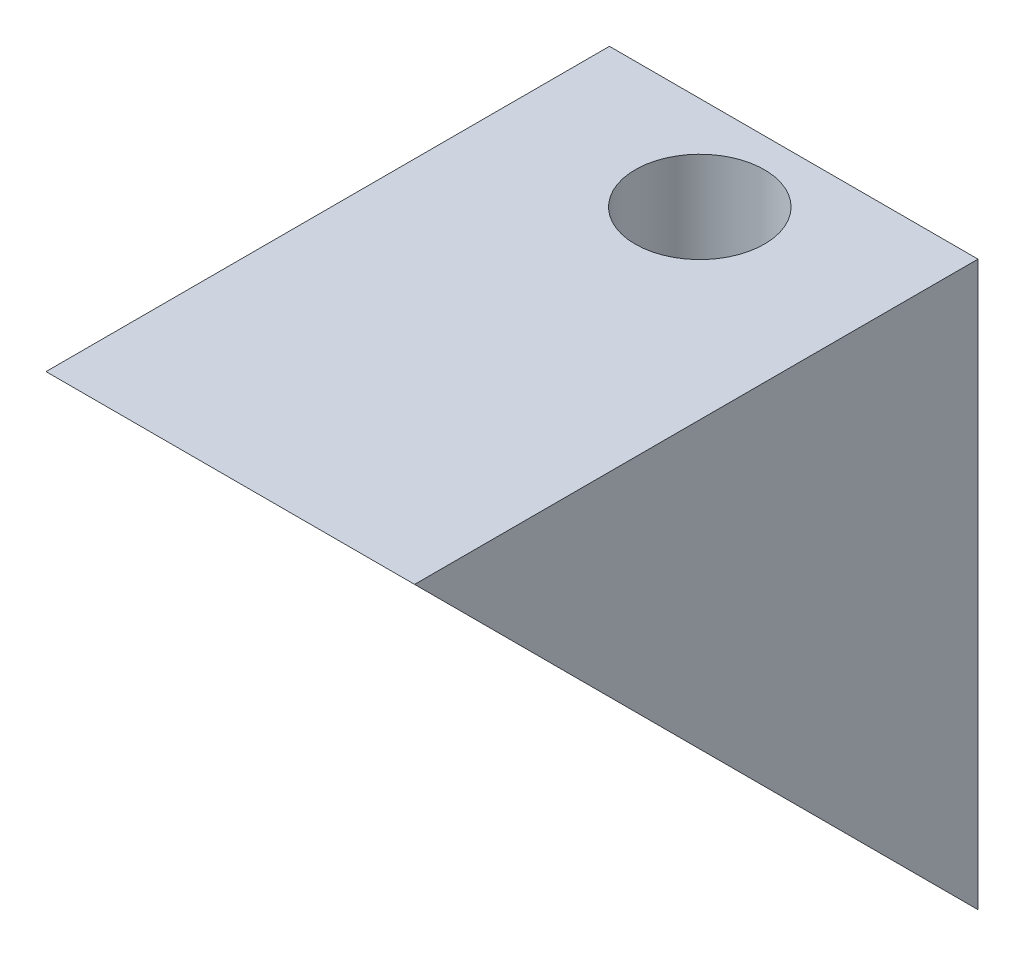
ISO-10303-21;
HEADER;
FILE_DESCRIPTION(('STEP AP214'),'2;1');
FILE_NAME('part.step','',(''),(''),'','','');
FILE_SCHEMA(('AUTOMOTIVE_DESIGN { 1 0 10303 214 1 1 1 1 }'));
ENDSEC;
DATA;
#1=APPLICATION_CONTEXT('core data for automotive mechanical design processes');
#2=APPLICATION_PROTOCOL_DEFINITION('international standard','automotive_design',2000,#1);
#3=PRODUCT_CONTEXT('',#1,'mechanical');
#4=PRODUCT('Part','Part','',(#3));
#5=PRODUCT_RELATED_PRODUCT_CATEGORY('part','',(#4));
#6=PRODUCT_DEFINITION_FORMATION('','',#4);
#7=PRODUCT_DEFINITION_CONTEXT('part definition',#1,'design');
#8=PRODUCT_DEFINITION('design','',#6,#7);
#9=PRODUCT_DEFINITION_SHAPE('','',#8);
#10=(LENGTH_UNIT() NAMED_UNIT(*) SI_UNIT(.MILLI.,.METRE.));
#11=(NAMED_UNIT(*) PLANE_ANGLE_UNIT() SI_UNIT($,.RADIAN.));
#12=(NAMED_UNIT(*) SI_UNIT($,.STERADIAN.) SOLID_ANGLE_UNIT());
#13=UNCERTAINTY_MEASURE_WITH_UNIT(LENGTH_MEASURE(1.E-05),#10,'distance_accuracy_value','');
#14=(GEOMETRIC_REPRESENTATION_CONTEXT(3) GLOBAL_UNCERTAINTY_ASSIGNED_CONTEXT((#13)) GLOBAL_UNIT_ASSIGNED_CONTEXT((#10,
#11,#12)) REPRESENTATION_CONTEXT('',''));
#15=CARTESIAN_POINT('',(0.,0.,0.));
#16=DIRECTION('',(0.,0.,1.));
#17=DIRECTION('',(1.,0.,0.));
#18=AXIS2_PLACEMENT_3D('',#15,#16,#17);
#19=CARTESIAN_POINT('',(39.25,-24.35604681,100.));
#20=DIRECTION('',(0.,-1.,0.));
#21=DIRECTION('',(0.,0.,-1.));
#22=AXIS2_PLACEMENT_3D('',#19,#20,#21);
#23=PLANE('',#22);
#24=CARTESIAN_POINT('',(0.,-24.35604681,0.));
#25=DIRECTION('',(0.,1.,0.));
#26=DIRECTION('',(0.,0.,1.));
#27=AXIS2_PLACEMENT_3D('',#24,#25,#26);
#28=CIRCLE('',#27,13.75);
#29=CARTESIAN_POINT('',(0.,-24.35604681,13.75));
#30=VERTEX_POINT('',#29);
#31=EDGE_CURVE('E97',#30,#30,#28,.T.);
#32=ORIENTED_EDGE('',*,*,#31,.F.);
#33=EDGE_LOOP('',(#32));
#34=FACE_BOUND('',#33,.T.);
#35=DIRECTION('',(0.,0.,1.));
#36=VECTOR('',#35,1.);
#37=CARTESIAN_POINT('',(-39.25,-24.35604681,100.));
#38=LINE('',#37,#36);
#39=CARTESIAN_POINT('',(-39.25,-24.35604681,-20.));
#40=VERTEX_POINT('',#39);
#41=CARTESIAN_POINT('',(-39.25,-24.35604681,100.));
#42=VERTEX_POINT('',#41);
#43=EDGE_CURVE('E90',#40,#42,#38,.T.);
#44=ORIENTED_EDGE('',*,*,#43,.T.);
#45=DIRECTION('',(-1.,0.,0.));
#46=VECTOR('',#45,1.);
#47=CARTESIAN_POINT('',(39.25,-24.35604681,100.));
#48=LINE('',#47,#46);
#49=CARTESIAN_POINT('',(39.25,-24.35604681,100.));
#50=VERTEX_POINT('',#49);
#51=EDGE_CURVE('E12',#50,#42,#48,.T.);
#52=ORIENTED_EDGE('',*,*,#51,.F.);
#53=DIRECTION('',(0.,0.,1.));
#54=VECTOR('',#53,1.);
#55=CARTESIAN_POINT('',(39.25,-24.35604681,100.));
#56=LINE('',#55,#54);
#57=CARTESIAN_POINT('',(39.25,-24.35604681,-20.));
#58=VERTEX_POINT('',#57);
#59=EDGE_CURVE('E83',#58,#50,#56,.T.);
#60=ORIENTED_EDGE('',*,*,#59,.F.);
#61=DIRECTION('',(-1.,0.,0.));
#62=VECTOR('',#61,1.);
#63=CARTESIAN_POINT('',(39.25,-24.35604681,-20.));
#64=LINE('',#63,#62);
#65=EDGE_CURVE('E91',#58,#40,#64,.T.);
#66=ORIENTED_EDGE('',*,*,#65,.T.);
#67=EDGE_LOOP('',(#44,#52,#60,#66));
#68=FACE_BOUND('',#67,.T.);
#69=ADVANCED_FACE('F36',(#34,#68),#23,.F.);
#70=CARTESIAN_POINT('',(39.25,-24.35604681,100.));
#71=DIRECTION('',(0.,0.707106781186549,-0.707106781186546));
#72=DIRECTION('',(0.,0.707106781186546,0.707106781186549));
#73=AXIS2_PLACEMENT_3D('',#70,#71,#72);
#74=PLANE('',#73);
#75=DIRECTION('',(0.,-0.707106781186546,-0.707106781186549));
#76=VECTOR('',#75,1.);
#77=CARTESIAN_POINT('',(-39.25,-24.35604681,100.));
#78=LINE('',#77,#76);
#79=CARTESIAN_POINT('',(-39.25,-144.35604681,-20.));
#80=VERTEX_POINT('',#79);
#81=EDGE_CURVE('E71',#42,#80,#78,.T.);
#82=ORIENTED_EDGE('',*,*,#81,.T.);
#83=DIRECTION('',(-1.,0.,0.));
#84=VECTOR('',#83,1.);
#85=CARTESIAN_POINT('',(39.25,-144.35604681,-20.));
#86=LINE('',#85,#84);
#87=CARTESIAN_POINT('',(39.25,-144.35604681,-20.));
#88=VERTEX_POINT('',#87);
#89=EDGE_CURVE('E50',#88,#80,#86,.T.);
#90=ORIENTED_EDGE('',*,*,#89,.F.);
#91=DIRECTION('',(0.,-0.707106781186546,-0.707106781186549));
#92=VECTOR('',#91,1.);
#93=CARTESIAN_POINT('',(39.25,-24.35604681,100.));
#94=LINE('',#93,#92);
#95=EDGE_CURVE('E79',#50,#88,#94,.T.);
#96=ORIENTED_EDGE('',*,*,#95,.F.);
#97=ORIENTED_EDGE('',*,*,#51,.T.);
#98=EDGE_LOOP('',(#82,#90,#96,#97));
#99=FACE_BOUND('',#98,.T.);
#100=ADVANCED_FACE('F80',(#99),#74,.F.);
#101=CARTESIAN_POINT('',(39.25,-24.35604681,-20.));
#102=DIRECTION('',(0.,0.,1.));
#103=DIRECTION('',(0.,-1.,0.));
#104=AXIS2_PLACEMENT_3D('',#101,#102,#103);
#105=PLANE('',#104);
#106=CARTESIAN_POINT('',(0.,-59.35604681,-20.));
#107=DIRECTION('',(0.,0.,-1.));
#108=DIRECTION('',(0.,1.,0.));
#109=AXIS2_PLACEMENT_3D('',#106,#107,#108);
#110=CIRCLE('',#109,3.5);
#111=CARTESIAN_POINT('',(0.,-55.85604681,-20.));
#112=VERTEX_POINT('',#111);
#113=EDGE_CURVE('E109',#112,#112,#110,.T.);
#114=ORIENTED_EDGE('',*,*,#113,.F.);
#115=EDGE_LOOP('',(#114));
#116=FACE_BOUND('',#115,.T.);
#117=CARTESIAN_POINT('',(0.,-74.35604681,-20.));
#118=DIRECTION('',(0.,0.,-1.));
#119=DIRECTION('',(0.,1.,0.));
#120=AXIS2_PLACEMENT_3D('',#117,#118,#119);
#121=CIRCLE('',#120,3.50000000000001);
#122=CARTESIAN_POINT('',(0.,-70.85604681,-20.));
#123=VERTEX_POINT('',#122);
#124=EDGE_CURVE('E187',#123,#123,#121,.T.);
#125=ORIENTED_EDGE('',*,*,#124,.F.);
#126=EDGE_LOOP('',(#125));
#127=FACE_BOUND('',#126,.T.);
#128=DIRECTION('',(0.,1.,0.));
#129=VECTOR('',#128,1.);
#130=CARTESIAN_POINT('',(-39.25,-24.35604681,-20.));
#131=LINE('',#130,#129);
#132=EDGE_CURVE('E76',#80,#40,#131,.T.);
#133=ORIENTED_EDGE('',*,*,#132,.T.);
#134=ORIENTED_EDGE('',*,*,#65,.F.);
#135=DIRECTION('',(0.,1.,0.));
#136=VECTOR('',#135,1.);
#137=CARTESIAN_POINT('',(39.25,-24.35604681,-20.));
#138=LINE('',#137,#136);
#139=EDGE_CURVE('E59',#88,#58,#138,.T.);
#140=ORIENTED_EDGE('',*,*,#139,.F.);
#141=ORIENTED_EDGE('',*,*,#89,.T.);
#142=EDGE_LOOP('',(#133,#134,#140,#141));
#143=FACE_BOUND('',#142,.T.);
#144=ADVANCED_FACE('F153',(#116,#127,#143),#105,.F.);
#145=CARTESIAN_POINT('',(39.25,0.,0.));
#146=DIRECTION('',(-1.,0.,0.));
#147=DIRECTION('',(0.,0.,1.));
#148=AXIS2_PLACEMENT_3D('',#145,#146,#147);
#149=PLANE('',#148);
#150=ORIENTED_EDGE('',*,*,#59,.T.);
#151=ORIENTED_EDGE('',*,*,#95,.T.);
#152=ORIENTED_EDGE('',*,*,#139,.T.);
#153=EDGE_LOOP('',(#150,#151,#152));
#154=FACE_BOUND('',#153,.T.);
#155=ADVANCED_FACE('F86',(#154),#149,.F.);
#156=CARTESIAN_POINT('',(-39.25,0.,0.));
#157=DIRECTION('',(-1.,0.,0.));
#158=DIRECTION('',(0.,0.,1.));
#159=AXIS2_PLACEMENT_3D('',#156,#157,#158);
#160=PLANE('',#159);
#161=ORIENTED_EDGE('',*,*,#43,.F.);
#162=ORIENTED_EDGE('',*,*,#132,.F.);
#163=ORIENTED_EDGE('',*,*,#81,.F.);
#164=EDGE_LOOP('',(#161,#162,#163));
#165=FACE_BOUND('',#164,.T.);
#166=ADVANCED_FACE('F160',(#165),#160,.T.);
#167=CARTESIAN_POINT('',(0.,-54.35604681,0.));
#168=DIRECTION('',(0.,1.,0.));
#169=DIRECTION('',(0.,0.,1.));
#170=AXIS2_PLACEMENT_3D('',#167,#168,#169);
#171=CYLINDRICAL_SURFACE('',#170,13.75);
#172=CARTESIAN_POINT('',(0.,-54.35604681,0.));
#173=DIRECTION('',(0.,1.,0.));
#174=DIRECTION('',(0.,0.,1.));
#175=AXIS2_PLACEMENT_3D('',#172,#173,#174);
#176=CIRCLE('',#175,13.75);
#177=CARTESIAN_POINT('',(0.,-54.35604681,13.75));
#178=VERTEX_POINT('',#177);
#179=EDGE_CURVE('E93',#178,#178,#176,.T.);
#180=ORIENTED_EDGE('',*,*,#179,.F.);
#181=EDGE_LOOP('',(#180));
#182=FACE_BOUND('',#181,.T.);
#183=ORIENTED_EDGE('',*,*,#31,.T.);
#184=EDGE_LOOP('',(#183));
#185=FACE_BOUND('',#184,.T.);
#186=ADVANCED_FACE('F147',(#182,#185),#171,.F.);
#187=CARTESIAN_POINT('',(0.,-54.35604681,0.));
#188=DIRECTION('',(0.,1.,0.));
#189=DIRECTION('',(0.,0.,1.));
#190=AXIS2_PLACEMENT_3D('',#187,#188,#189);
#191=PLANE('',#190);
#192=CARTESIAN_POINT('',(0.,-54.35604681,0.));
#193=DIRECTION('',(0.,1.,0.));
#194=DIRECTION('',(0.,0.,1.));
#195=AXIS2_PLACEMENT_3D('',#192,#193,#194);
#196=CIRCLE('',#195,10.1);
#197=CARTESIAN_POINT('',(0.,-54.35604681,10.1));
#198=VERTEX_POINT('',#197);
#199=EDGE_CURVE('E139',#198,#198,#196,.T.);
#200=ORIENTED_EDGE('',*,*,#199,.F.);
#201=EDGE_LOOP('',(#200));
#202=FACE_BOUND('',#201,.T.);
#203=ORIENTED_EDGE('',*,*,#179,.T.);
#204=EDGE_LOOP('',(#203));
#205=FACE_BOUND('',#204,.T.);
#206=ADVANCED_FACE('F123',(#202,#205),#191,.T.);
#207=CARTESIAN_POINT('',(0.,-84.35604681,0.));
#208=DIRECTION('',(0.,1.,0.));
#209=DIRECTION('',(0.,0.,1.));
#210=AXIS2_PLACEMENT_3D('',#207,#208,#209);
#211=PLANE('',#210);
#212=CARTESIAN_POINT('',(0.,-84.35604681,0.));
#213=DIRECTION('',(0.,1.,0.));
#214=DIRECTION('',(0.,0.,1.));
#215=AXIS2_PLACEMENT_3D('',#212,#213,#214);
#216=CIRCLE('',#215,9.5);
#217=CARTESIAN_POINT('',(0.,-84.35604681,9.5));
#218=VERTEX_POINT('',#217);
#219=EDGE_CURVE('E132',#218,#218,#216,.T.);
#220=ORIENTED_EDGE('',*,*,#219,.T.);
#221=EDGE_LOOP('',(#220));
#222=FACE_BOUND('',#221,.T.);
#223=ADVANCED_FACE('F120',(#222),#211,.T.);
#224=CARTESIAN_POINT('',(0.,-84.35604681,0.));
#225=DIRECTION('',(0.,1.,0.));
#226=DIRECTION('',(0.,0.,1.));
#227=AXIS2_PLACEMENT_3D('',#224,#225,#226);
#228=CONICAL_SURFACE('',#227,9.5,0.0199973339731505);
#229=CARTESIAN_POINT('',(-2.58201939740681,-61.718921294905,-9.6119851907806));
#230=CARTESIAN_POINT('',(-2.71236973137917,-61.5764828166199,-9.57992152612602));
#231=CARTESIAN_POINT('',(-2.83097248247537,-61.4231876758991,-9.54842095491079));
#232=CARTESIAN_POINT('',(-3.04158905887252,-61.0985018492966,-9.49025414096341));
#233=CARTESIAN_POINT('',(-3.13361241418318,-60.9271176793838,-9.46358616679058));
#234=CARTESIAN_POINT('',(-3.2884809808705,-60.57006419376,-9.41846215352416));
#235=CARTESIAN_POINT('',(-3.35125437185349,-60.3843610073078,-9.4000263322433));
#236=CARTESIAN_POINT('',(-3.4449892283669,-60.0043580770517,-9.3741819587663));
#237=CARTESIAN_POINT('',(-3.47596107110103,-59.8100611590797,-9.36676980906758));
#238=CARTESIAN_POINT('',(-3.50433984978546,-59.4268760744014,-9.36437098442674));
#239=CARTESIAN_POINT('',(-3.50305298462761,-59.2380867589754,-9.36889414106958));
#240=CARTESIAN_POINT('',(-3.47029681052306,-58.8637670438215,-9.38905706488923));
#241=CARTESIAN_POINT('',(-3.43882730737294,-58.6782366650703,-9.40469690359368));
#242=CARTESIAN_POINT('',(-3.34761377520433,-58.3179831694567,-9.44518626886772));
#243=CARTESIAN_POINT('',(-3.28824392047876,-58.1431506484808,-9.46991300091001));
#244=CARTESIAN_POINT('',(-3.14334549924877,-57.8058545640709,-9.5260913716928));
#245=CARTESIAN_POINT('',(-3.05781019908335,-57.6433941980606,-9.55754474090148));
#246=CARTESIAN_POINT('',(-2.85766098333135,-57.326067202852,-9.62596214699992));
#247=CARTESIAN_POINT('',(-2.74173682025032,-57.1720710450562,-9.66313090881959));
#248=CARTESIAN_POINT('',(-2.48628632731484,-56.8851569507851,-9.7379085881953));
#249=CARTESIAN_POINT('',(-2.34675279312978,-56.7522454722969,-9.77551763683312));
#250=CARTESIAN_POINT('',(-2.04098721135056,-56.5056937319486,-9.84903326270974));
#251=CARTESIAN_POINT('',(-1.87388459336361,-56.3930879480704,-9.88480348877476));
#252=CARTESIAN_POINT('',(-1.52174958430814,-56.197758368973,-9.94904773264359));
#253=CARTESIAN_POINT('',(-1.33672128709907,-56.1150277711786,-9.97752341098509));
#254=CARTESIAN_POINT('',(-0.959623803056336,-55.9844388593931,-10.0233372064292));
#255=CARTESIAN_POINT('',(-0.767925463836306,-55.9356202733142,-10.0409802156533));
#256=CARTESIAN_POINT('',(-0.378363483986849,-55.8709667268788,-10.0644792768575));
#257=CARTESIAN_POINT('',(-0.180502302053071,-55.8551187795516,-10.0703399698028));
#258=CARTESIAN_POINT('',(0.204241777691315,-55.8570070473154,-10.069648130062));
#259=CARTESIAN_POINT('',(0.391137347006137,-55.8729661952627,-10.0637524198804));
#260=CARTESIAN_POINT('',(0.759364799929047,-55.9343215034837,-10.0414523810524));
#261=CARTESIAN_POINT('',(0.940696721172309,-55.9797174645869,-10.0250481235074));
#262=CARTESIAN_POINT('',(1.292473514902,-56.0981504418451,-9.98339850426264));
#263=CARTESIAN_POINT('',(1.46294359202036,-56.1711205236371,-9.95817456275357));
#264=CARTESIAN_POINT('',(1.78943463299328,-56.3424219840047,-9.90123745289614));
#265=CARTESIAN_POINT('',(1.94545198501305,-56.4407596790064,-9.86952266876294));
#266=CARTESIAN_POINT('',(2.24725792837589,-56.6658658106568,-9.8007134416711));
#267=CARTESIAN_POINT('',(2.39210421804733,-56.7938388128792,-9.76342592353129));
#268=CARTESIAN_POINT('',(2.65881264956121,-57.0717881757329,-9.68843279031808));
#269=CARTESIAN_POINT('',(2.78066708891278,-57.2217718803517,-9.65072703959597));
#270=CARTESIAN_POINT('',(3.00263922358571,-57.5465388760475,-9.57723796190652));
#271=CARTESIAN_POINT('',(3.10172448712101,-57.7220609565485,-9.5415868600036));
#272=CARTESIAN_POINT('',(3.26868079755507,-58.0886646193109,-9.47793989841857));
#273=CARTESIAN_POINT('',(3.3365611378316,-58.2797415490826,-9.44994176055683));
#274=CARTESIAN_POINT('',(3.43684189571894,-58.6657014763994,-9.40570941708431));
#275=CARTESIAN_POINT('',(3.4703116172217,-58.8602652344402,-9.38912632898276));
#276=CARTESIAN_POINT('',(3.50401638816326,-59.2528718744232,-9.36822043314272));
#277=CARTESIAN_POINT('',(3.50426513095359,-59.4509132892447,-9.3638925746425));
#278=CARTESIAN_POINT('',(3.47235808872159,-59.8328882478777,-9.36761827225549));
#279=CARTESIAN_POINT('',(3.44203700721299,-60.0169854988537,-9.374984389152));
#280=CARTESIAN_POINT('',(3.35280392642501,-60.3774091310191,-9.39961089087964));
#281=CARTESIAN_POINT('',(3.29388918160101,-60.553734764209,-9.41687222587192));
#282=CARTESIAN_POINT('',(3.14880884843814,-60.8954457306937,-9.45916997071793));
#283=CARTESIAN_POINT('',(3.06242691616913,-61.0607311528926,-9.48426807722839));
#284=CARTESIAN_POINT('',(2.86501366309831,-61.3749962020036,-9.53919342061848));
#285=CARTESIAN_POINT('',(2.75397520323971,-61.5239710876689,-9.56902202645165));
#286=CARTESIAN_POINT('',(2.50313176191756,-61.8101276969745,-9.63185848774859));
#287=CARTESIAN_POINT('',(2.36206881036129,-61.9461900530742,-9.66495088296791));
#288=CARTESIAN_POINT('',(2.05892796453689,-62.1931300701925,-9.72898601033028));
#289=CARTESIAN_POINT('',(1.89684707139614,-62.3040041310818,-9.7599284347427));
#290=CARTESIAN_POINT('',(1.55268663000347,-62.4991261882879,-9.81665797715129));
#291=CARTESIAN_POINT('',(1.37030964790856,-62.582880441524,-9.8423466621675));
#292=CARTESIAN_POINT('',(0.993009668541796,-62.7181980646067,-9.88481481228722));
#293=CARTESIAN_POINT('',(0.798090816791161,-62.7697720114732,-9.90159720443877));
#294=CARTESIAN_POINT('',(0.409843238759442,-62.8373171488154,-9.92373965215336));
#295=CARTESIAN_POINT('',(0.216779454927066,-62.8546667460497,-9.92954153809739));
#296=CARTESIAN_POINT('',(-0.169558021453091,-62.85726759664,-9.93040550806121));
#297=CARTESIAN_POINT('',(-0.362831654543645,-62.8425263351644,-9.92547009654766));
#298=CARTESIAN_POINT('',(-0.737789219785745,-62.7825021902172,-9.90575362415688));
#299=CARTESIAN_POINT('',(-0.919646565264239,-62.7381894576409,-9.89128548861528));
#300=CARTESIAN_POINT('',(-1.27330030767453,-62.6215341183204,-9.85436103090737));
#301=CARTESIAN_POINT('',(-1.4450928691076,-62.5491809048387,-9.83190168620856));
#302=CARTESIAN_POINT('',(-1.79249884021066,-62.369233063775,-9.77852114896076));
#303=CARTESIAN_POINT('',(-1.96646276159579,-62.2586424332364,-9.74694183720316));
#304=CARTESIAN_POINT('',(-2.2920412756116,-62.0090918681913,-9.68069252566385));
#305=CARTESIAN_POINT('',(-2.4436491432807,-61.8701234271667,-9.64602160090141));
#306=CARTESIAN_POINT('',(-2.58201939740681,-61.718921294905,-9.6119851907806));
#307=B_SPLINE_CURVE_WITH_KNOTS('',3,(#229,#230,#231,#232,#233,#234,#235,#236,#237,#238,#239,
#240,#241,#242,#243,#244,#245,#246,#247,#248,#249,#250,#251,#252,#253,#254,#255,#256,#257,#258,
#259,#260,#261,#262,#263,#264,#265,#266,#267,#268,#269,#270,#271,#272,#273,#274,#275,#276,#277,
#278,#279,#280,#281,#282,#283,#284,#285,#286,#287,#288,#289,#290,#291,#292,#293,#294,#295,#296,
#297,#298,#299,#300,#301,#302,#303,#304,#305,#306),.UNSPECIFIED.,.T.,.F.,(4,2,2,2,2,2,2,2,2,2,2,
2,2,2,2,2,2,2,2,2,2,2,2,2,2,2,2,2,2,2,2,2,2,2,2,2,2,2,4),(0.,0.586480930157814,1.17275131651615,
1.76045374316282,2.34796433487837,2.91172573547181,3.47549076348617,4.03190190543298,
4.5884563600754,5.17476874404634,5.76126036325538,6.37220384898778,6.98300813513461,
7.57572165638535,8.16820166648709,8.72850676470416,9.28880807191398,9.84775793164215,
10.4068471020367,10.9947659903713,11.5828814888346,12.1939214083318,12.8047792312574,
13.3960217864229,13.9870206366326,14.5445433214085,15.1021195497376,15.6642010670553,
16.2264455422874,16.8200128833519,17.413665008906,18.0175859260587,18.6213082418412,
19.2001742025233,19.7789051576266,20.339526316997,20.9003597471371,21.5227375995311,
22.1453022901844),.UNSPECIFIED.);
#308=CARTESIAN_POINT('',(-2.58201939740681,-61.718921294905,-9.6119851907806));
#309=VERTEX_POINT('',#308);
#310=EDGE_CURVE('E39',#309,#309,#307,.T.);
#311=ORIENTED_EDGE('',*,*,#310,.T.);
#312=EDGE_LOOP('',(#311));
#313=FACE_BOUND('',#312,.T.);
#314=CARTESIAN_POINT('',(-2.541357770541,-76.7626005040012,-9.31128747537693));
#315=CARTESIAN_POINT('',(-2.67434651001117,-76.6221641704277,-9.27790403021557));
#316=CARTESIAN_POINT('',(-2.79570955794298,-76.4706628399704,-9.2448869882134));
#317=CARTESIAN_POINT('',(-3.01207242312748,-76.1490730976494,-9.18344570557781));
#318=CARTESIAN_POINT('',(-3.1070830153937,-75.9789923223315,-9.15501958979458));
#319=CARTESIAN_POINT('',(-3.2681131697801,-75.6239270928773,-9.10633128637559));
#320=CARTESIAN_POINT('',(-3.33405672825665,-75.4389050461999,-9.08609051279875));
#321=CARTESIAN_POINT('',(-3.43415713594233,-75.0596042911592,-9.05685023472531));
#322=CARTESIAN_POINT('',(-3.468325479861,-74.8653289569363,-9.0478466647577));
#323=CARTESIAN_POINT('',(-3.50278450952854,-74.4821361764064,-9.04277908126541));
#324=CARTESIAN_POINT('',(-3.50447873182569,-74.2933512365931,-9.04617139198613));
#325=CARTESIAN_POINT('',(-3.4776265457098,-73.9185365323737,-9.06455652592108));
#326=CARTESIAN_POINT('',(-3.44908058706822,-73.7325067270314,-9.07954917659904));
#327=CARTESIAN_POINT('',(-3.36376823388948,-73.3717618086157,-9.11918153409972));
#328=CARTESIAN_POINT('',(-3.30752041574595,-73.1969030904908,-9.14364226272841));
#329=CARTESIAN_POINT('',(-3.16897725142413,-72.8590696778561,-9.19972028995207));
#330=CARTESIAN_POINT('',(-3.08667517408884,-72.696098067801,-9.2313394373333));
#331=CARTESIAN_POINT('',(-2.89309421714647,-72.376976825694,-9.30056711491508));
#332=CARTESIAN_POINT('',(-2.78047316649746,-72.2216921796271,-9.33840908652195));
#333=CARTESIAN_POINT('',(-2.53154602560265,-71.9316239599831,-9.41494731695034));
#334=CARTESIAN_POINT('',(-2.39523196160013,-71.7968473169952,-9.45364385953358));
#335=CARTESIAN_POINT('',(-2.09498254594491,-71.5451388311153,-9.52994800026844));
#336=CARTESIAN_POINT('',(-1.9300436080298,-71.4293568978062,-9.56741684555859));
#337=CARTESIAN_POINT('',(-1.58163178975381,-71.2273146963018,-9.63523429105008));
#338=CARTESIAN_POINT('',(-1.39816275832033,-71.1410483136319,-9.6655843655738));
#339=CARTESIAN_POINT('',(-1.02302703533039,-71.0031025682591,-9.71512377600462));
#340=CARTESIAN_POINT('',(-0.831726011244467,-70.9505348835012,-9.73459784900181));
#341=CARTESIAN_POINT('',(-0.442195264103098,-70.8784544500146,-9.76148802545446));
#342=CARTESIAN_POINT('',(-0.24396858111709,-70.8589273793898,-9.76890935327745));
#343=CARTESIAN_POINT('',(0.141362780348318,-70.853908916131,-9.77080968071312));
#344=CARTESIAN_POINT('',(0.328441834807549,-70.8664988561634,-9.76601828190521));
#345=CARTESIAN_POINT('',(0.697595736984559,-70.9211997071091,-9.74551052458066));
#346=CARTESIAN_POINT('',(0.879670711504152,-70.9633098692712,-9.72979444315786));
#347=CARTESIAN_POINT('',(1.23267794376269,-71.0751052756731,-9.68912863976965));
#348=CARTESIAN_POINT('',(1.40367513015958,-71.1446088818014,-9.66423980885573));
#349=CARTESIAN_POINT('',(1.73175830065386,-71.3089659668174,-9.60753580760251));
#350=CARTESIAN_POINT('',(1.88884089320504,-71.4038256034777,-9.57571895512506));
#351=CARTESIAN_POINT('',(2.19353343627295,-71.6219412826835,-9.50620465096175));
#352=CARTESIAN_POINT('',(2.34021245673457,-71.746427146325,-9.46828609874026));
#353=CARTESIAN_POINT('',(2.61118906699309,-72.0175736121,-9.39154254549161));
#354=CARTESIAN_POINT('',(2.7354783263552,-72.1642424305399,-9.35271721312807));
#355=CARTESIAN_POINT('',(2.96368890431624,-72.4834244914785,-9.27629579613234));
#356=CARTESIAN_POINT('',(3.06645672845041,-72.6567977755894,-9.23883144555925));
#357=CARTESIAN_POINT('',(3.24113596650478,-73.0197935119219,-9.17131548213324));
#358=CARTESIAN_POINT('',(3.31305573273163,-73.2094115490711,-9.14126186371578));
#359=CARTESIAN_POINT('',(3.42165712711243,-73.5938397006905,-9.09294672374671));
#360=CARTESIAN_POINT('',(3.45931508785294,-73.7883319530498,-9.07436368484169));
#361=CARTESIAN_POINT('',(3.50123431048817,-74.1816349177639,-9.04984285486704));
#362=CARTESIAN_POINT('',(3.50551142861742,-74.3804435347925,-9.04389906100573));
#363=CARTESIAN_POINT('',(3.48116232251337,-74.7635493644534,-9.04508423374097));
#364=CARTESIAN_POINT('',(3.45456038071149,-74.9479818393086,-9.05142526413258));
#365=CARTESIAN_POINT('',(3.3726822038434,-75.3096727443911,-9.07453288664398));
#366=CARTESIAN_POINT('',(3.31740352649274,-75.4869305621947,-9.09130036676754));
#367=CARTESIAN_POINT('',(3.17978186674326,-75.8302700693448,-9.13307159334484));
#368=CARTESIAN_POINT('',(3.09734111550472,-75.9963087349784,-9.15810509374697));
#369=CARTESIAN_POINT('',(2.90782717836153,-76.3127216060931,-9.21339201557296));
#370=CARTESIAN_POINT('',(2.80074671201072,-76.4630911626106,-9.2436469791524));
#371=CARTESIAN_POINT('',(2.55756751298499,-76.7532877269506,-9.30793804068099));
#372=CARTESIAN_POINT('',(2.42012807470623,-76.8919669115731,-9.34209192553926));
#373=CARTESIAN_POINT('',(2.12387423587238,-77.1447903601761,-9.40867992033011));
#374=CARTESIAN_POINT('',(1.96505587640677,-77.2589300697891,-9.44111371018422));
#375=CARTESIAN_POINT('',(1.62599233000967,-77.461856579964,-9.50132757617387));
#376=CARTESIAN_POINT('',(1.44533896619274,-77.5500012378171,-9.52898373132779));
#377=CARTESIAN_POINT('',(1.07061696562655,-77.6943175598406,-9.57541437617427));
#378=CARTESIAN_POINT('',(0.876552843273469,-77.7504999250859,-9.59419183812495));
#379=CARTESIAN_POINT('',(0.489133409676413,-77.827084999388,-9.62002688724943));
#380=CARTESIAN_POINT('',(0.296083032348389,-77.8488760518988,-9.6275385906639));
#381=CARTESIAN_POINT('',(-0.0910405031607343,-77.8602138930388,-9.63143001130211));
#382=CARTESIAN_POINT('',(-0.285113358936663,-77.8497697337558,-9.62781285366298));
#383=CARTESIAN_POINT('',(-0.661359870568957,-77.7980456661934,-9.61020564260387));
#384=CARTESIAN_POINT('',(-0.843709547789327,-77.7579016021231,-9.59659781542791));
#385=CARTESIAN_POINT('',(-1.19900771803247,-77.6495117410294,-9.56089860313963));
#386=CARTESIAN_POINT('',(-1.37195218880778,-77.5812540262095,-9.53880362046332));
#387=CARTESIAN_POINT('',(-1.7261264333146,-77.4079807854945,-9.48505234122667));
#388=CARTESIAN_POINT('',(-1.90543696129027,-77.2993027910052,-9.45251898197467));
#389=CARTESIAN_POINT('',(-2.24145042560636,-77.0522345095053,-9.38361220566691));
#390=CARTESIAN_POINT('',(-2.39814506448047,-76.9138333635682,-9.34723738766445));
#391=CARTESIAN_POINT('',(-2.541357770541,-76.7626005040012,-9.31128747537693));
#392=B_SPLINE_CURVE_WITH_KNOTS('',3,(#314,#315,#316,#317,#318,#319,#320,#321,#322,#323,#324,
#325,#326,#327,#328,#329,#330,#331,#332,#333,#334,#335,#336,#337,#338,#339,#340,#341,#342,#343,
#344,#345,#346,#347,#348,#349,#350,#351,#352,#353,#354,#355,#356,#357,#358,#359,#360,#361,#362,
#363,#364,#365,#366,#367,#368,#369,#370,#371,#372,#373,#374,#375,#376,#377,#378,#379,#380,#381,
#382,#383,#384,#385,#386,#387,#388,#389,#390,#391),.UNSPECIFIED.,.T.,.F.,(4,2,2,2,2,2,2,2,2,2,2,
2,2,2,2,2,2,2,2,2,2,2,2,2,2,2,2,2,2,2,2,2,2,2,2,2,2,2,4),(0.,0.588112829092724,1.17598483444702,
1.76538500183763,2.35457187020643,2.91823368698525,3.48188712036751,4.03536859056282,
4.58899317038466,5.17299519075851,5.75719413579299,6.36910805486859,6.98089513230817,
7.57580848386755,8.17046389615388,8.73043671096933,9.29039532314245,9.84670184128488,
10.4031435827304,10.9888126022389,11.5746990803387,12.1866760951383,12.7984873085369,
13.3922620191434,13.9857546636392,14.542437629541,15.0991680137207,15.6579246290055,
16.2168465559846,16.8087918123284,17.4008468352197,18.0064929226563,18.6119361183881,
19.1922485998966,19.772398136561,20.3314378528321,20.8907147987008,21.5238091370068,
22.157135161893),.UNSPECIFIED.);
#393=CARTESIAN_POINT('',(-2.541357770541,-76.7626005040012,-9.31128747537693));
#394=VERTEX_POINT('',#393);
#395=EDGE_CURVE('E103',#394,#394,#392,.T.);
#396=ORIENTED_EDGE('',*,*,#395,.T.);
#397=EDGE_LOOP('',(#396));
#398=FACE_BOUND('',#397,.T.);
#399=ORIENTED_EDGE('',*,*,#219,.F.);
#400=EDGE_LOOP('',(#399));
#401=FACE_BOUND('',#400,.T.);
#402=ORIENTED_EDGE('',*,*,#199,.T.);
#403=EDGE_LOOP('',(#402));
#404=FACE_BOUND('',#403,.T.);
#405=ADVANCED_FACE('F110',(#313,#398,#401,#404),#228,.F.);
#406=CARTESIAN_POINT('',(0.,-74.35604681,-5.00000000000002));
#407=DIRECTION('',(0.,0.,-1.));
#408=DIRECTION('',(0.,1.,0.));
#409=AXIS2_PLACEMENT_3D('',#406,#407,#408);
#410=CYLINDRICAL_SURFACE('',#409,3.50000000000001);
#411=ORIENTED_EDGE('',*,*,#124,.T.);
#412=EDGE_LOOP('',(#411));
#413=FACE_BOUND('',#412,.T.);
#414=ORIENTED_EDGE('',*,*,#395,.F.);
#415=EDGE_LOOP('',(#414));
#416=FACE_BOUND('',#415,.T.);
#417=ADVANCED_FACE('F114',(#413,#416),#410,.F.);
#418=CARTESIAN_POINT('',(0.,-59.35604681,-5.00000000000002));
#419=DIRECTION('',(0.,0.,-1.));
#420=DIRECTION('',(0.,1.,0.));
#421=AXIS2_PLACEMENT_3D('',#418,#419,#420);
#422=CYLINDRICAL_SURFACE('',#421,3.5);
#423=ORIENTED_EDGE('',*,*,#113,.T.);
#424=EDGE_LOOP('',(#423));
#425=FACE_BOUND('',#424,.T.);
#426=ORIENTED_EDGE('',*,*,#310,.F.);
#427=EDGE_LOOP('',(#426));
#428=FACE_BOUND('',#427,.T.);
#429=ADVANCED_FACE('F117',(#425,#428),#422,.F.);
#430=CLOSED_SHELL('',(#69,#100,#144,#155,#166,#186,#206,#223,#405,#417,#429));
#431=MANIFOLD_SOLID_BREP('B2',#430);
#432=ADVANCED_BREP_SHAPE_REPRESENTATION('',(#18,#431),#14);
#433=SHAPE_DEFINITION_REPRESENTATION(#9,#432);
ENDSEC;
END-ISO-10303-21;
